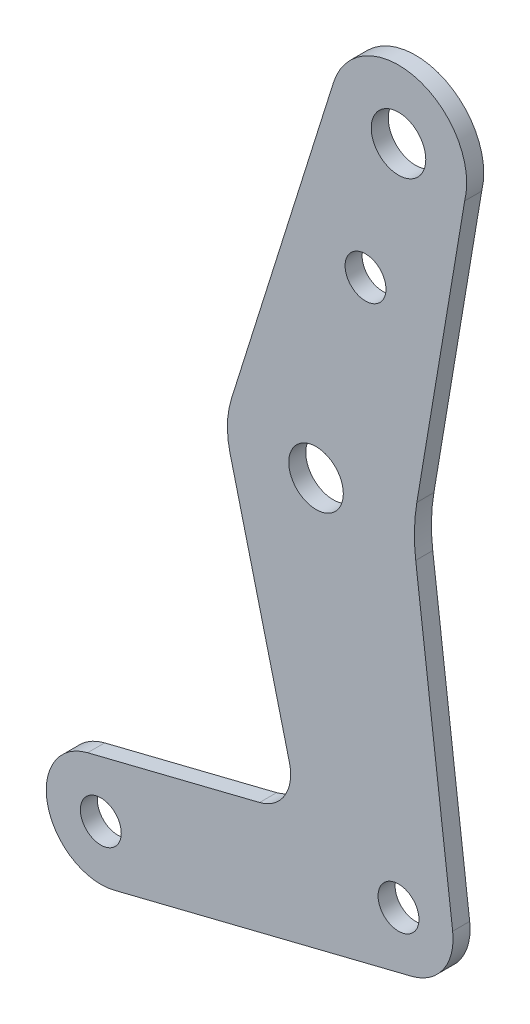
ISO-10303-21;
HEADER;
FILE_DESCRIPTION(('STEP AP214'),'2;1');
FILE_NAME('part.step','',(''),(''),'','','');
FILE_SCHEMA(('AUTOMOTIVE_DESIGN { 1 0 10303 214 1 1 1 1 }'));
ENDSEC;
DATA;
#1=APPLICATION_CONTEXT('core data for automotive mechanical design processes');
#2=APPLICATION_PROTOCOL_DEFINITION('international standard','automotive_design',2000,#1);
#3=PRODUCT_CONTEXT('',#1,'mechanical');
#4=PRODUCT('Part','Part','',(#3));
#5=PRODUCT_RELATED_PRODUCT_CATEGORY('part','',(#4));
#6=PRODUCT_DEFINITION_FORMATION('','',#4);
#7=PRODUCT_DEFINITION_CONTEXT('part definition',#1,'design');
#8=PRODUCT_DEFINITION('design','',#6,#7);
#9=PRODUCT_DEFINITION_SHAPE('','',#8);
#10=(LENGTH_UNIT() NAMED_UNIT(*) SI_UNIT(.MILLI.,.METRE.));
#11=(NAMED_UNIT(*) PLANE_ANGLE_UNIT() SI_UNIT($,.RADIAN.));
#12=(NAMED_UNIT(*) SI_UNIT($,.STERADIAN.) SOLID_ANGLE_UNIT());
#13=UNCERTAINTY_MEASURE_WITH_UNIT(LENGTH_MEASURE(1.E-05),#10,'distance_accuracy_value','');
#14=(GEOMETRIC_REPRESENTATION_CONTEXT(3) GLOBAL_UNCERTAINTY_ASSIGNED_CONTEXT((#13)) GLOBAL_UNIT_ASSIGNED_CONTEXT((#10,
#11,#12)) REPRESENTATION_CONTEXT('',''));
#15=CARTESIAN_POINT('',(0.,0.,0.));
#16=DIRECTION('',(0.,0.,1.));
#17=DIRECTION('',(1.,0.,0.));
#18=AXIS2_PLACEMENT_3D('',#15,#16,#17);
#19=CARTESIAN_POINT('',(0.,0.,2.5));
#20=DIRECTION('',(0.,0.,1.));
#21=DIRECTION('',(1.,0.,0.));
#22=AXIS2_PLACEMENT_3D('',#19,#20,#21);
#23=PLANE('',#22);
#24=CARTESIAN_POINT('',(43.6633076824198,10.8864853019851,2.5));
#25=DIRECTION('',(0.,0.,1.));
#26=DIRECTION('',(1.,0.,0.));
#27=AXIS2_PLACEMENT_3D('',#24,#25,#26);
#28=CIRCLE('',#27,3.);
#29=CARTESIAN_POINT('',(46.6633076824198,10.8864853019851,2.5));
#30=VERTEX_POINT('',#29);
#31=EDGE_CURVE('E342',#30,#30,#28,.T.);
#32=ORIENTED_EDGE('',*,*,#31,.F.);
#33=EDGE_LOOP('',(#32));
#34=FACE_BOUND('',#33,.T.);
#35=CARTESIAN_POINT('',(43.6633076824198,107.916057929585,2.5));
#36=DIRECTION('',(0.,0.,1.));
#37=DIRECTION('',(1.,0.,0.));
#38=AXIS2_PLACEMENT_3D('',#35,#36,#37);
#39=CIRCLE('',#38,4.);
#40=CARTESIAN_POINT('',(47.6633076824198,107.916057929585,2.5));
#41=VERTEX_POINT('',#40);
#42=EDGE_CURVE('E358',#41,#41,#39,.T.);
#43=ORIENTED_EDGE('',*,*,#42,.F.);
#44=EDGE_LOOP('',(#43));
#45=FACE_BOUND('',#44,.T.);
#46=CARTESIAN_POINT('',(0.,0.,2.5));
#47=DIRECTION('',(0.,0.,1.));
#48=DIRECTION('',(1.,0.,0.));
#49=AXIS2_PLACEMENT_3D('',#46,#47,#48);
#50=CIRCLE('',#49,8.);
#51=CARTESIAN_POINT('',(-1.93537516479735,7.76236581020797,2.5));
#52=VERTEX_POINT('',#51);
#53=CARTESIAN_POINT('',(1.93537516479735,-7.76236581020797,2.5));
#54=VERTEX_POINT('',#53);
#55=EDGE_CURVE('E206',#52,#54,#50,.T.);
#56=ORIENTED_EDGE('',*,*,#55,.T.);
#57=DIRECTION('',(0.970295726275996,0.241921895599669,0.));
#58=VECTOR('',#57,1.);
#59=CARTESIAN_POINT('',(1.93537516479735,-7.76236581020797,2.5));
#60=LINE('',#59,#58);
#61=CARTESIAN_POINT('',(45.5986828472172,3.12411949177712,2.5));
#62=VERTEX_POINT('',#61);
#63=EDGE_CURVE('E118',#54,#62,#60,.T.);
#64=ORIENTED_EDGE('',*,*,#63,.T.);
#65=CARTESIAN_POINT('',(43.6633076824198,10.8864853019851,2.5));
#66=DIRECTION('',(0.,0.,1.));
#67=DIRECTION('',(1.,0.,0.));
#68=AXIS2_PLACEMENT_3D('',#65,#66,#67);
#69=CIRCLE('',#68,8.);
#70=CARTESIAN_POINT('',(51.6044068697643,11.8554763735418,2.5));
#71=VERTEX_POINT('',#70);
#72=EDGE_CURVE('E243',#62,#71,#69,.T.);
#73=ORIENTED_EDGE('',*,*,#72,.T.);
#74=DIRECTION('',(-0.12112388394459,0.992637398418062,0.));
#75=VECTOR('',#74,1.);
#76=CARTESIAN_POINT('',(51.6044068697643,11.8554763735418,2.5));
#77=LINE('',#76,#75);
#78=CARTESIAN_POINT('',(46.1870354139465,56.2520506332256,2.5));
#79=VERTEX_POINT('',#78);
#80=EDGE_CURVE('E263',#71,#79,#77,.T.);
#81=ORIENTED_EDGE('',*,*,#80,.T.);
#82=CARTESIAN_POINT('',(71.9956077728161,59.4012716157849,2.5));
#83=DIRECTION('',(0.,0.,-1.));
#84=DIRECTION('',(-1.,0.,0.));
#85=AXIS2_PLACEMENT_3D('',#82,#83,#84);
#86=CIRCLE('',#85,26.);
#87=CARTESIAN_POINT('',(46.3540256389407,63.703511226932,2.5));
#88=VERTEX_POINT('',#87);
#89=EDGE_CURVE('E259',#79,#88,#86,.T.);
#90=ORIENTED_EDGE('',*,*,#89,.T.);
#91=DIRECTION('',(0.165470754274889,0.986214697456745,0.));
#92=VECTOR('',#91,1.);
#93=CARTESIAN_POINT('',(46.3540256389407,63.703511226932,2.5));
#94=LINE('',#93,#92);
#95=CARTESIAN_POINT('',(53.3662649451797,105.496838973588,2.5));
#96=VERTEX_POINT('',#95);
#97=EDGE_CURVE('E262',#88,#96,#94,.T.);
#98=ORIENTED_EDGE('',*,*,#97,.T.);
#99=CARTESIAN_POINT('',(43.6633076824198,107.916057929585,2.5));
#100=DIRECTION('',(0.,0.,1.));
#101=DIRECTION('',(1.,0.,0.));
#102=AXIS2_PLACEMENT_3D('',#99,#100,#101);
#103=CIRCLE('',#102,10.);
#104=CARTESIAN_POINT('',(34.122984627241,110.913095801021,2.5));
#105=VERTEX_POINT('',#104);
#106=EDGE_CURVE('E267',#96,#105,#103,.T.);
#107=ORIENTED_EDGE('',*,*,#106,.T.);
#108=DIRECTION('',(-0.299703787143641,-0.954032305517879,0.));
#109=VECTOR('',#108,1.);
#110=CARTESIAN_POINT('',(19.164792930704,63.2974208486522,2.5));
#111=LINE('',#110,#109);
#112=CARTESIAN_POINT('',(19.164792930704,63.2974208486522,2.5));
#113=VERTEX_POINT('',#112);
#114=EDGE_CURVE('E274',#105,#113,#111,.T.);
#115=ORIENTED_EDGE('',*,*,#114,.T.);
#116=CARTESIAN_POINT('',(31.5672129024364,59.4012716157849,2.5));
#117=DIRECTION('',(0.,0.,1.));
#118=DIRECTION('',(-1.,0.,0.));
#119=AXIS2_PLACEMENT_3D('',#116,#117,#118);
#120=CIRCLE('',#119,13.);
#121=CARTESIAN_POINT('',(18.9533684608484,56.2562869729892,2.5));
#122=VERTEX_POINT('',#121);
#123=EDGE_CURVE('E149',#113,#122,#120,.T.);
#124=ORIENTED_EDGE('',*,*,#123,.T.);
#125=DIRECTION('',(0.241921895599669,-0.970295726275996,0.));
#126=VECTOR('',#125,1.);
#127=CARTESIAN_POINT('',(27.6625567024365,21.3256408270534,2.5));
#128=LINE('',#127,#126);
#129=CARTESIAN_POINT('',(27.6625567024365,21.3256408270534,2.5));
#130=VERTEX_POINT('',#129);
#131=EDGE_CURVE('E143',#122,#130,#128,.T.);
#132=ORIENTED_EDGE('',*,*,#131,.T.);
#133=CARTESIAN_POINT('',(21.8407823447805,19.8741094534553,2.5));
#134=DIRECTION('',(0.,0.,-1.));
#135=DIRECTION('',(1.,0.,0.));
#136=AXIS2_PLACEMENT_3D('',#133,#134,#135);
#137=CIRCLE('',#136,6.);
#138=CARTESIAN_POINT('',(23.2923137183786,14.0523350957994,2.5));
#139=VERTEX_POINT('',#138);
#140=EDGE_CURVE('E147',#130,#139,#137,.T.);
#141=ORIENTED_EDGE('',*,*,#140,.T.);
#142=DIRECTION('',(-0.970295726275996,-0.241921895599669,0.));
#143=VECTOR('',#142,1.);
#144=CARTESIAN_POINT('',(-1.93537516479735,7.76236581020797,2.5));
#145=LINE('',#144,#143);
#146=EDGE_CURVE('E63',#139,#52,#145,.T.);
#147=ORIENTED_EDGE('',*,*,#146,.T.);
#148=EDGE_LOOP('',(#56,#64,#73,#81,#90,#98,#107,#115,#124,#132,#141,#147));
#149=FACE_BOUND('',#148,.T.);
#150=CARTESIAN_POINT('',(0.,0.,2.5));
#151=DIRECTION('',(0.,0.,1.));
#152=DIRECTION('',(1.,0.,0.));
#153=AXIS2_PLACEMENT_3D('',#150,#151,#152);
#154=CIRCLE('',#153,3.);
#155=CARTESIAN_POINT('',(3.,0.,2.5));
#156=VERTEX_POINT('',#155);
#157=EDGE_CURVE('E176',#156,#156,#154,.T.);
#158=ORIENTED_EDGE('',*,*,#157,.F.);
#159=EDGE_LOOP('',(#158));
#160=FACE_BOUND('',#159,.T.);
#161=CARTESIAN_POINT('',(38.8248697704264,88.5101434040649,2.5));
#162=DIRECTION('',(0.,0.,1.));
#163=DIRECTION('',(1.,0.,0.));
#164=AXIS2_PLACEMENT_3D('',#161,#162,#163);
#165=CIRCLE('',#164,3.);
#166=CARTESIAN_POINT('',(41.8248697704264,88.5101434040649,2.5));
#167=VERTEX_POINT('',#166);
#168=EDGE_CURVE('E350',#167,#167,#165,.T.);
#169=ORIENTED_EDGE('',*,*,#168,.F.);
#170=EDGE_LOOP('',(#169));
#171=FACE_BOUND('',#170,.T.);
#172=CARTESIAN_POINT('',(31.5672129024364,59.4012716157849,2.5));
#173=DIRECTION('',(0.,0.,1.));
#174=DIRECTION('',(1.,0.,0.));
#175=AXIS2_PLACEMENT_3D('',#172,#173,#174);
#176=CIRCLE('',#175,4.);
#177=CARTESIAN_POINT('',(35.5672129024364,59.4012716157849,2.5));
#178=VERTEX_POINT('',#177);
#179=EDGE_CURVE('E331',#178,#178,#176,.T.);
#180=ORIENTED_EDGE('',*,*,#179,.F.);
#181=EDGE_LOOP('',(#180));
#182=FACE_BOUND('',#181,.T.);
#183=ADVANCED_FACE('F45',(#34,#45,#149,#160,#171,#182),#23,.T.);
#184=CARTESIAN_POINT('',(0.,0.,0.));
#185=DIRECTION('',(0.,0.,1.));
#186=DIRECTION('',(1.,0.,0.));
#187=AXIS2_PLACEMENT_3D('',#184,#185,#186);
#188=PLANE('',#187);
#189=CARTESIAN_POINT('',(0.,0.,0.));
#190=DIRECTION('',(0.,0.,1.));
#191=DIRECTION('',(1.,0.,0.));
#192=AXIS2_PLACEMENT_3D('',#189,#190,#191);
#193=CIRCLE('',#192,8.);
#194=CARTESIAN_POINT('',(-1.93537516479735,7.76236581020797,0.));
#195=VERTEX_POINT('',#194);
#196=CARTESIAN_POINT('',(1.93537516479735,-7.76236581020797,0.));
#197=VERTEX_POINT('',#196);
#198=EDGE_CURVE('E171',#195,#197,#193,.T.);
#199=ORIENTED_EDGE('',*,*,#198,.F.);
#200=DIRECTION('',(-0.970295726275996,-0.241921895599669,0.));
#201=VECTOR('',#200,1.);
#202=CARTESIAN_POINT('',(-1.93537516479735,7.76236581020797,0.));
#203=LINE('',#202,#201);
#204=CARTESIAN_POINT('',(23.2923137183786,14.0523350957994,0.));
#205=VERTEX_POINT('',#204);
#206=EDGE_CURVE('E110',#205,#195,#203,.T.);
#207=ORIENTED_EDGE('',*,*,#206,.F.);
#208=CARTESIAN_POINT('',(21.8407823447805,19.8741094534553,0.));
#209=DIRECTION('',(0.,0.,-1.));
#210=DIRECTION('',(1.,0.,0.));
#211=AXIS2_PLACEMENT_3D('',#208,#209,#210);
#212=CIRCLE('',#211,6.);
#213=CARTESIAN_POINT('',(27.6625567024365,21.3256408270534,0.));
#214=VERTEX_POINT('',#213);
#215=EDGE_CURVE('E104',#214,#205,#212,.T.);
#216=ORIENTED_EDGE('',*,*,#215,.F.);
#217=DIRECTION('',(0.241921895599669,-0.970295726275996,0.));
#218=VECTOR('',#217,1.);
#219=CARTESIAN_POINT('',(27.6625567024365,21.3256408270534,0.));
#220=LINE('',#219,#218);
#221=CARTESIAN_POINT('',(18.9533684608484,56.2562869729892,0.));
#222=VERTEX_POINT('',#221);
#223=EDGE_CURVE('E158',#222,#214,#220,.T.);
#224=ORIENTED_EDGE('',*,*,#223,.F.);
#225=CARTESIAN_POINT('',(31.5672129024364,59.4012716157849,0.));
#226=DIRECTION('',(0.,0.,1.));
#227=DIRECTION('',(-1.,0.,0.));
#228=AXIS2_PLACEMENT_3D('',#225,#226,#227);
#229=CIRCLE('',#228,13.);
#230=CARTESIAN_POINT('',(19.164792930704,63.2974208486522,0.));
#231=VERTEX_POINT('',#230);
#232=EDGE_CURVE('E197',#231,#222,#229,.T.);
#233=ORIENTED_EDGE('',*,*,#232,.F.);
#234=DIRECTION('',(-0.299703787143641,-0.954032305517879,0.));
#235=VECTOR('',#234,1.);
#236=CARTESIAN_POINT('',(19.164792930704,63.2974208486522,0.));
#237=LINE('',#236,#235);
#238=CARTESIAN_POINT('',(34.122984627241,110.913095801021,0.));
#239=VERTEX_POINT('',#238);
#240=EDGE_CURVE('E194',#239,#231,#237,.T.);
#241=ORIENTED_EDGE('',*,*,#240,.F.);
#242=CARTESIAN_POINT('',(43.6633076824198,107.916057929585,0.));
#243=DIRECTION('',(0.,0.,1.));
#244=DIRECTION('',(1.,0.,0.));
#245=AXIS2_PLACEMENT_3D('',#242,#243,#244);
#246=CIRCLE('',#245,10.);
#247=CARTESIAN_POINT('',(53.3662649451797,105.496838973588,0.));
#248=VERTEX_POINT('',#247);
#249=EDGE_CURVE('E191',#248,#239,#246,.T.);
#250=ORIENTED_EDGE('',*,*,#249,.F.);
#251=DIRECTION('',(0.165470754274889,0.986214697456745,0.));
#252=VECTOR('',#251,1.);
#253=CARTESIAN_POINT('',(46.3540256389407,63.703511226932,0.));
#254=LINE('',#253,#252);
#255=CARTESIAN_POINT('',(46.3540256389407,63.703511226932,0.));
#256=VERTEX_POINT('',#255);
#257=EDGE_CURVE('E188',#256,#248,#254,.T.);
#258=ORIENTED_EDGE('',*,*,#257,.F.);
#259=CARTESIAN_POINT('',(71.9956077728161,59.4012716157849,0.));
#260=DIRECTION('',(0.,0.,-1.));
#261=DIRECTION('',(-1.,0.,0.));
#262=AXIS2_PLACEMENT_3D('',#259,#260,#261);
#263=CIRCLE('',#262,26.);
#264=CARTESIAN_POINT('',(46.1870354139465,56.2520506332256,0.));
#265=VERTEX_POINT('',#264);
#266=EDGE_CURVE('E185',#265,#256,#263,.T.);
#267=ORIENTED_EDGE('',*,*,#266,.F.);
#268=DIRECTION('',(-0.12112388394459,0.992637398418062,0.));
#269=VECTOR('',#268,1.);
#270=CARTESIAN_POINT('',(51.6044068697643,11.8554763735418,0.));
#271=LINE('',#270,#269);
#272=CARTESIAN_POINT('',(51.6044068697643,11.8554763735418,0.));
#273=VERTEX_POINT('',#272);
#274=EDGE_CURVE('E182',#273,#265,#271,.T.);
#275=ORIENTED_EDGE('',*,*,#274,.F.);
#276=CARTESIAN_POINT('',(43.6633076824198,10.8864853019851,0.));
#277=DIRECTION('',(0.,0.,1.));
#278=DIRECTION('',(1.,0.,0.));
#279=AXIS2_PLACEMENT_3D('',#276,#277,#278);
#280=CIRCLE('',#279,8.);
#281=CARTESIAN_POINT('',(45.5986828472172,3.12411949177712,0.));
#282=VERTEX_POINT('',#281);
#283=EDGE_CURVE('E179',#282,#273,#280,.T.);
#284=ORIENTED_EDGE('',*,*,#283,.F.);
#285=DIRECTION('',(0.970295726275996,0.241921895599669,0.));
#286=VECTOR('',#285,1.);
#287=CARTESIAN_POINT('',(1.93537516479735,-7.76236581020797,0.));
#288=LINE('',#287,#286);
#289=EDGE_CURVE('E175',#197,#282,#288,.T.);
#290=ORIENTED_EDGE('',*,*,#289,.F.);
#291=EDGE_LOOP('',(#199,#207,#216,#224,#233,#241,#250,#258,#267,#275,#284,#290));
#292=FACE_BOUND('',#291,.T.);
#293=CARTESIAN_POINT('',(0.,0.,0.));
#294=DIRECTION('',(0.,0.,1.));
#295=DIRECTION('',(1.,0.,0.));
#296=AXIS2_PLACEMENT_3D('',#293,#294,#295);
#297=CIRCLE('',#296,3.);
#298=CARTESIAN_POINT('',(3.,0.,0.));
#299=VERTEX_POINT('',#298);
#300=EDGE_CURVE('E362',#299,#299,#297,.T.);
#301=ORIENTED_EDGE('',*,*,#300,.T.);
#302=EDGE_LOOP('',(#301));
#303=FACE_BOUND('',#302,.T.);
#304=CARTESIAN_POINT('',(43.6633076824198,107.916057929585,0.));
#305=DIRECTION('',(0.,0.,1.));
#306=DIRECTION('',(1.,0.,0.));
#307=AXIS2_PLACEMENT_3D('',#304,#305,#306);
#308=CIRCLE('',#307,4.);
#309=CARTESIAN_POINT('',(47.6633076824198,107.916057929585,0.));
#310=VERTEX_POINT('',#309);
#311=EDGE_CURVE('E354',#310,#310,#308,.T.);
#312=ORIENTED_EDGE('',*,*,#311,.T.);
#313=EDGE_LOOP('',(#312));
#314=FACE_BOUND('',#313,.T.);
#315=CARTESIAN_POINT('',(38.8248697704264,88.5101434040649,0.));
#316=DIRECTION('',(0.,0.,1.));
#317=DIRECTION('',(1.,0.,0.));
#318=AXIS2_PLACEMENT_3D('',#315,#316,#317);
#319=CIRCLE('',#318,3.);
#320=CARTESIAN_POINT('',(41.8248697704264,88.5101434040649,0.));
#321=VERTEX_POINT('',#320);
#322=EDGE_CURVE('E346',#321,#321,#319,.T.);
#323=ORIENTED_EDGE('',*,*,#322,.T.);
#324=EDGE_LOOP('',(#323));
#325=FACE_BOUND('',#324,.T.);
#326=CARTESIAN_POINT('',(43.6633076824198,10.8864853019851,0.));
#327=DIRECTION('',(0.,0.,1.));
#328=DIRECTION('',(1.,0.,0.));
#329=AXIS2_PLACEMENT_3D('',#326,#327,#328);
#330=CIRCLE('',#329,3.);
#331=CARTESIAN_POINT('',(46.6633076824198,10.8864853019851,0.));
#332=VERTEX_POINT('',#331);
#333=EDGE_CURVE('E339',#332,#332,#330,.T.);
#334=ORIENTED_EDGE('',*,*,#333,.T.);
#335=EDGE_LOOP('',(#334));
#336=FACE_BOUND('',#335,.T.);
#337=CARTESIAN_POINT('',(31.5672129024364,59.4012716157849,0.));
#338=DIRECTION('',(0.,0.,1.));
#339=DIRECTION('',(1.,0.,0.));
#340=AXIS2_PLACEMENT_3D('',#337,#338,#339);
#341=CIRCLE('',#340,4.);
#342=CARTESIAN_POINT('',(35.5672129024364,59.4012716157849,0.));
#343=VERTEX_POINT('',#342);
#344=EDGE_CURVE('E334',#343,#343,#341,.T.);
#345=ORIENTED_EDGE('',*,*,#344,.T.);
#346=EDGE_LOOP('',(#345));
#347=FACE_BOUND('',#346,.T.);
#348=ADVANCED_FACE('F247',(#292,#303,#314,#325,#336,#347),#188,.F.);
#349=CARTESIAN_POINT('',(0.,0.,2.5));
#350=DIRECTION('',(0.,0.,-1.));
#351=DIRECTION('',(-1.,0.,0.));
#352=AXIS2_PLACEMENT_3D('',#349,#350,#351);
#353=CYLINDRICAL_SURFACE('',#352,8.);
#354=ORIENTED_EDGE('',*,*,#198,.T.);
#355=DIRECTION('',(0.,0.,-1.));
#356=VECTOR('',#355,1.);
#357=CARTESIAN_POINT('',(1.93537516479735,-7.76236581020797,2.5));
#358=LINE('',#357,#356);
#359=EDGE_CURVE('E11',#54,#197,#358,.T.);
#360=ORIENTED_EDGE('',*,*,#359,.F.);
#361=ORIENTED_EDGE('',*,*,#55,.F.);
#362=DIRECTION('',(0.,0.,-1.));
#363=VECTOR('',#362,1.);
#364=CARTESIAN_POINT('',(-1.93537516479735,7.76236581020797,2.5));
#365=LINE('',#364,#363);
#366=EDGE_CURVE('E167',#52,#195,#365,.T.);
#367=ORIENTED_EDGE('',*,*,#366,.T.);
#368=EDGE_LOOP('',(#354,#360,#361,#367));
#369=FACE_BOUND('',#368,.T.);
#370=ADVANCED_FACE('F47',(#369),#353,.T.);
#371=CARTESIAN_POINT('',(1.93537516479735,-7.76236581020797,2.5));
#372=DIRECTION('',(-0.241921895599669,0.970295726275996,0.));
#373=DIRECTION('',(-0.970295726275996,-0.241921895599669,0.));
#374=AXIS2_PLACEMENT_3D('',#371,#372,#373);
#375=PLANE('',#374);
#376=ORIENTED_EDGE('',*,*,#289,.T.);
#377=DIRECTION('',(0.,0.,-1.));
#378=VECTOR('',#377,1.);
#379=CARTESIAN_POINT('',(45.5986828472172,3.12411949177712,2.5));
#380=LINE('',#379,#378);
#381=EDGE_CURVE('E55',#62,#282,#380,.T.);
#382=ORIENTED_EDGE('',*,*,#381,.F.);
#383=ORIENTED_EDGE('',*,*,#63,.F.);
#384=ORIENTED_EDGE('',*,*,#359,.T.);
#385=EDGE_LOOP('',(#376,#382,#383,#384));
#386=FACE_BOUND('',#385,.T.);
#387=ADVANCED_FACE('F492',(#386),#375,.F.);
#388=CARTESIAN_POINT('',(43.6633076824198,10.8864853019851,2.5));
#389=DIRECTION('',(0.,0.,-1.));
#390=DIRECTION('',(-1.,0.,0.));
#391=AXIS2_PLACEMENT_3D('',#388,#389,#390);
#392=CYLINDRICAL_SURFACE('',#391,8.);
#393=ORIENTED_EDGE('',*,*,#283,.T.);
#394=DIRECTION('',(0.,0.,-1.));
#395=VECTOR('',#394,1.);
#396=CARTESIAN_POINT('',(51.6044068697643,11.8554763735418,2.5));
#397=LINE('',#396,#395);
#398=EDGE_CURVE('E233',#71,#273,#397,.T.);
#399=ORIENTED_EDGE('',*,*,#398,.F.);
#400=ORIENTED_EDGE('',*,*,#72,.F.);
#401=ORIENTED_EDGE('',*,*,#381,.T.);
#402=EDGE_LOOP('',(#393,#399,#400,#401));
#403=FACE_BOUND('',#402,.T.);
#404=ADVANCED_FACE('F241',(#403),#392,.T.);
#405=CARTESIAN_POINT('',(51.6044068697643,11.8554763735418,2.5));
#406=DIRECTION('',(-0.992637398418062,-0.12112388394459,0.));
#407=DIRECTION('',(0.12112388394459,-0.992637398418062,0.));
#408=AXIS2_PLACEMENT_3D('',#405,#406,#407);
#409=PLANE('',#408);
#410=ORIENTED_EDGE('',*,*,#274,.T.);
#411=DIRECTION('',(0.,0.,-1.));
#412=VECTOR('',#411,1.);
#413=CARTESIAN_POINT('',(46.1870354139465,56.2520506332256,2.5));
#414=LINE('',#413,#412);
#415=EDGE_CURVE('E229',#79,#265,#414,.T.);
#416=ORIENTED_EDGE('',*,*,#415,.F.);
#417=ORIENTED_EDGE('',*,*,#80,.F.);
#418=ORIENTED_EDGE('',*,*,#398,.T.);
#419=EDGE_LOOP('',(#410,#416,#417,#418));
#420=FACE_BOUND('',#419,.T.);
#421=ADVANCED_FACE('F253',(#420),#409,.F.);
#422=CARTESIAN_POINT('',(71.9956077728161,59.4012716157849,2.5));
#423=DIRECTION('',(0.,0.,-1.));
#424=DIRECTION('',(-1.,0.,0.));
#425=AXIS2_PLACEMENT_3D('',#422,#423,#424);
#426=CYLINDRICAL_SURFACE('',#425,26.);
#427=ORIENTED_EDGE('',*,*,#266,.T.);
#428=DIRECTION('',(0.,0.,-1.));
#429=VECTOR('',#428,1.);
#430=CARTESIAN_POINT('',(46.3540256389407,63.703511226932,2.5));
#431=LINE('',#430,#429);
#432=EDGE_CURVE('E225',#88,#256,#431,.T.);
#433=ORIENTED_EDGE('',*,*,#432,.F.);
#434=ORIENTED_EDGE('',*,*,#89,.F.);
#435=ORIENTED_EDGE('',*,*,#415,.T.);
#436=EDGE_LOOP('',(#427,#433,#434,#435));
#437=FACE_BOUND('',#436,.T.);
#438=ADVANCED_FACE('F257',(#437),#426,.F.);
#439=CARTESIAN_POINT('',(46.3540256389407,63.703511226932,2.5));
#440=DIRECTION('',(-0.986214697456745,0.165470754274889,0.));
#441=DIRECTION('',(-0.165470754274889,-0.986214697456745,0.));
#442=AXIS2_PLACEMENT_3D('',#439,#440,#441);
#443=PLANE('',#442);
#444=ORIENTED_EDGE('',*,*,#257,.T.);
#445=DIRECTION('',(0.,0.,-1.));
#446=VECTOR('',#445,1.);
#447=CARTESIAN_POINT('',(53.3662649451797,105.496838973588,2.5));
#448=LINE('',#447,#446);
#449=EDGE_CURVE('E221',#96,#248,#448,.T.);
#450=ORIENTED_EDGE('',*,*,#449,.F.);
#451=ORIENTED_EDGE('',*,*,#97,.F.);
#452=ORIENTED_EDGE('',*,*,#432,.T.);
#453=EDGE_LOOP('',(#444,#450,#451,#452));
#454=FACE_BOUND('',#453,.T.);
#455=ADVANCED_FACE('F457',(#454),#443,.F.);
#456=CARTESIAN_POINT('',(43.6633076824198,107.916057929585,2.5));
#457=DIRECTION('',(0.,0.,-1.));
#458=DIRECTION('',(-1.,0.,0.));
#459=AXIS2_PLACEMENT_3D('',#456,#457,#458);
#460=CYLINDRICAL_SURFACE('',#459,10.);
#461=ORIENTED_EDGE('',*,*,#249,.T.);
#462=DIRECTION('',(0.,0.,-1.));
#463=VECTOR('',#462,1.);
#464=CARTESIAN_POINT('',(34.122984627241,110.913095801021,2.5));
#465=LINE('',#464,#463);
#466=EDGE_CURVE('E217',#105,#239,#465,.T.);
#467=ORIENTED_EDGE('',*,*,#466,.F.);
#468=ORIENTED_EDGE('',*,*,#106,.F.);
#469=ORIENTED_EDGE('',*,*,#449,.T.);
#470=EDGE_LOOP('',(#461,#467,#468,#469));
#471=FACE_BOUND('',#470,.T.);
#472=ADVANCED_FACE('F448',(#471),#460,.T.);
#473=CARTESIAN_POINT('',(19.164792930704,63.2974208486522,2.5));
#474=DIRECTION('',(0.954032305517879,-0.299703787143641,0.));
#475=DIRECTION('',(0.299703787143641,0.954032305517879,0.));
#476=AXIS2_PLACEMENT_3D('',#473,#474,#475);
#477=PLANE('',#476);
#478=ORIENTED_EDGE('',*,*,#240,.T.);
#479=DIRECTION('',(0.,0.,-1.));
#480=VECTOR('',#479,1.);
#481=CARTESIAN_POINT('',(19.164792930704,63.2974208486522,2.5));
#482=LINE('',#481,#480);
#483=EDGE_CURVE('E213',#113,#231,#482,.T.);
#484=ORIENTED_EDGE('',*,*,#483,.F.);
#485=ORIENTED_EDGE('',*,*,#114,.F.);
#486=ORIENTED_EDGE('',*,*,#466,.T.);
#487=EDGE_LOOP('',(#478,#484,#485,#486));
#488=FACE_BOUND('',#487,.T.);
#489=ADVANCED_FACE('F282',(#488),#477,.F.);
#490=CARTESIAN_POINT('',(31.5672129024364,59.4012716157849,2.5));
#491=DIRECTION('',(0.,0.,-1.));
#492=DIRECTION('',(-1.,0.,0.));
#493=AXIS2_PLACEMENT_3D('',#490,#491,#492);
#494=CYLINDRICAL_SURFACE('',#493,13.);
#495=ORIENTED_EDGE('',*,*,#232,.T.);
#496=DIRECTION('',(0.,0.,-1.));
#497=VECTOR('',#496,1.);
#498=CARTESIAN_POINT('',(18.9533684608484,56.2562869729892,2.5));
#499=LINE('',#498,#497);
#500=EDGE_CURVE('E160',#122,#222,#499,.T.);
#501=ORIENTED_EDGE('',*,*,#500,.F.);
#502=ORIENTED_EDGE('',*,*,#123,.F.);
#503=ORIENTED_EDGE('',*,*,#483,.T.);
#504=EDGE_LOOP('',(#495,#501,#502,#503));
#505=FACE_BOUND('',#504,.T.);
#506=ADVANCED_FACE('F286',(#505),#494,.T.);
#507=CARTESIAN_POINT('',(27.6625567024365,21.3256408270534,2.5));
#508=DIRECTION('',(0.970295726275996,0.241921895599669,0.));
#509=DIRECTION('',(-0.241921895599669,0.970295726275996,0.));
#510=AXIS2_PLACEMENT_3D('',#507,#508,#509);
#511=PLANE('',#510);
#512=ORIENTED_EDGE('',*,*,#223,.T.);
#513=DIRECTION('',(0.,0.,-1.));
#514=VECTOR('',#513,1.);
#515=CARTESIAN_POINT('',(27.6625567024365,21.3256408270534,2.5));
#516=LINE('',#515,#514);
#517=EDGE_CURVE('E155',#130,#214,#516,.T.);
#518=ORIENTED_EDGE('',*,*,#517,.F.);
#519=ORIENTED_EDGE('',*,*,#131,.F.);
#520=ORIENTED_EDGE('',*,*,#500,.T.);
#521=EDGE_LOOP('',(#512,#518,#519,#520));
#522=FACE_BOUND('',#521,.T.);
#523=ADVANCED_FACE('F156',(#522),#511,.F.);
#524=CARTESIAN_POINT('',(21.8407823447805,19.8741094534553,2.5));
#525=DIRECTION('',(0.,0.,-1.));
#526=DIRECTION('',(-1.,0.,0.));
#527=AXIS2_PLACEMENT_3D('',#524,#525,#526);
#528=CYLINDRICAL_SURFACE('',#527,6.);
#529=ORIENTED_EDGE('',*,*,#215,.T.);
#530=DIRECTION('',(0.,0.,-1.));
#531=VECTOR('',#530,1.);
#532=CARTESIAN_POINT('',(23.2923137183786,14.0523350957994,2.5));
#533=LINE('',#532,#531);
#534=EDGE_CURVE('E161',#139,#205,#533,.T.);
#535=ORIENTED_EDGE('',*,*,#534,.F.);
#536=ORIENTED_EDGE('',*,*,#140,.F.);
#537=ORIENTED_EDGE('',*,*,#517,.T.);
#538=EDGE_LOOP('',(#529,#535,#536,#537));
#539=FACE_BOUND('',#538,.T.);
#540=ADVANCED_FACE('F163',(#539),#528,.F.);
#541=CARTESIAN_POINT('',(-1.93537516479735,7.76236581020797,2.5));
#542=DIRECTION('',(0.241921895599669,-0.970295726275996,0.));
#543=DIRECTION('',(0.970295726275996,0.241921895599669,0.));
#544=AXIS2_PLACEMENT_3D('',#541,#542,#543);
#545=PLANE('',#544);
#546=ORIENTED_EDGE('',*,*,#206,.T.);
#547=ORIENTED_EDGE('',*,*,#366,.F.);
#548=ORIENTED_EDGE('',*,*,#146,.F.);
#549=ORIENTED_EDGE('',*,*,#534,.T.);
#550=EDGE_LOOP('',(#546,#547,#548,#549));
#551=FACE_BOUND('',#550,.T.);
#552=ADVANCED_FACE('F290',(#551),#545,.F.);
#553=CARTESIAN_POINT('',(0.,0.,2.5));
#554=DIRECTION('',(0.,0.,-1.));
#555=DIRECTION('',(-1.,0.,0.));
#556=AXIS2_PLACEMENT_3D('',#553,#554,#555);
#557=CYLINDRICAL_SURFACE('',#556,3.);
#558=ORIENTED_EDGE('',*,*,#157,.T.);
#559=EDGE_LOOP('',(#558));
#560=FACE_BOUND('',#559,.T.);
#561=ORIENTED_EDGE('',*,*,#300,.F.);
#562=EDGE_LOOP('',(#561));
#563=FACE_BOUND('',#562,.T.);
#564=ADVANCED_FACE('F292',(#560,#563),#557,.F.);
#565=CARTESIAN_POINT('',(43.6633076824198,107.916057929585,2.5));
#566=DIRECTION('',(0.,0.,-1.));
#567=DIRECTION('',(-1.,0.,0.));
#568=AXIS2_PLACEMENT_3D('',#565,#566,#567);
#569=CYLINDRICAL_SURFACE('',#568,4.);
#570=ORIENTED_EDGE('',*,*,#42,.T.);
#571=EDGE_LOOP('',(#570));
#572=FACE_BOUND('',#571,.T.);
#573=ORIENTED_EDGE('',*,*,#311,.F.);
#574=EDGE_LOOP('',(#573));
#575=FACE_BOUND('',#574,.T.);
#576=ADVANCED_FACE('F298',(#572,#575),#569,.F.);
#577=CARTESIAN_POINT('',(38.8248697704264,88.5101434040649,2.5));
#578=DIRECTION('',(0.,0.,-1.));
#579=DIRECTION('',(-1.,0.,0.));
#580=AXIS2_PLACEMENT_3D('',#577,#578,#579);
#581=CYLINDRICAL_SURFACE('',#580,3.);
#582=ORIENTED_EDGE('',*,*,#168,.T.);
#583=EDGE_LOOP('',(#582));
#584=FACE_BOUND('',#583,.T.);
#585=ORIENTED_EDGE('',*,*,#322,.F.);
#586=EDGE_LOOP('',(#585));
#587=FACE_BOUND('',#586,.T.);
#588=ADVANCED_FACE('F314',(#584,#587),#581,.F.);
#589=CARTESIAN_POINT('',(43.6633076824198,10.8864853019851,2.5));
#590=DIRECTION('',(0.,0.,-1.));
#591=DIRECTION('',(-1.,0.,0.));
#592=AXIS2_PLACEMENT_3D('',#589,#590,#591);
#593=CYLINDRICAL_SURFACE('',#592,3.);
#594=ORIENTED_EDGE('',*,*,#31,.T.);
#595=EDGE_LOOP('',(#594));
#596=FACE_BOUND('',#595,.T.);
#597=ORIENTED_EDGE('',*,*,#333,.F.);
#598=EDGE_LOOP('',(#597));
#599=FACE_BOUND('',#598,.T.);
#600=ADVANCED_FACE('F318',(#596,#599),#593,.F.);
#601=CARTESIAN_POINT('',(31.5672129024364,59.4012716157849,2.5));
#602=DIRECTION('',(0.,0.,-1.));
#603=DIRECTION('',(-1.,0.,0.));
#604=AXIS2_PLACEMENT_3D('',#601,#602,#603);
#605=CYLINDRICAL_SURFACE('',#604,4.);
#606=ORIENTED_EDGE('',*,*,#179,.T.);
#607=EDGE_LOOP('',(#606));
#608=FACE_BOUND('',#607,.T.);
#609=ORIENTED_EDGE('',*,*,#344,.F.);
#610=EDGE_LOOP('',(#609));
#611=FACE_BOUND('',#610,.T.);
#612=ADVANCED_FACE('F322',(#608,#611),#605,.F.);
#613=CLOSED_SHELL('',(#183,#348,#370,#387,#404,#421,#438,#455,#472,#489,#506,#523,#540,#552,
#564,#576,#588,#600,#612));
#614=MANIFOLD_SOLID_BREP('B2',#613);
#615=ADVANCED_BREP_SHAPE_REPRESENTATION('',(#18,#614),#14);
#616=SHAPE_DEFINITION_REPRESENTATION(#9,#615);
ENDSEC;
END-ISO-10303-21;
